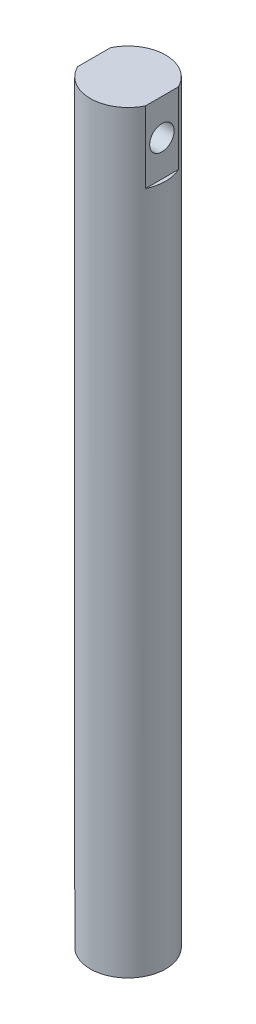
ISO-10303-21;
HEADER;
FILE_DESCRIPTION(('STEP AP214'),'2;1');
FILE_NAME('part.step','',(''),(''),'','','');
FILE_SCHEMA(('AUTOMOTIVE_DESIGN { 1 0 10303 214 1 1 1 1 }'));
ENDSEC;
DATA;
#1=APPLICATION_CONTEXT('core data for automotive mechanical design processes');
#2=APPLICATION_PROTOCOL_DEFINITION('international standard','automotive_design',2000,#1);
#3=PRODUCT_CONTEXT('',#1,'mechanical');
#4=PRODUCT('Part','Part','',(#3));
#5=PRODUCT_RELATED_PRODUCT_CATEGORY('part','',(#4));
#6=PRODUCT_DEFINITION_FORMATION('','',#4);
#7=PRODUCT_DEFINITION_CONTEXT('part definition',#1,'design');
#8=PRODUCT_DEFINITION('design','',#6,#7);
#9=PRODUCT_DEFINITION_SHAPE('','',#8);
#10=(LENGTH_UNIT() NAMED_UNIT(*) SI_UNIT(.MILLI.,.METRE.));
#11=(NAMED_UNIT(*) PLANE_ANGLE_UNIT() SI_UNIT($,.RADIAN.));
#12=(NAMED_UNIT(*) SI_UNIT($,.STERADIAN.) SOLID_ANGLE_UNIT());
#13=UNCERTAINTY_MEASURE_WITH_UNIT(LENGTH_MEASURE(1.E-05),#10,'distance_accuracy_value','');
#14=(GEOMETRIC_REPRESENTATION_CONTEXT(3) GLOBAL_UNCERTAINTY_ASSIGNED_CONTEXT((#13)) GLOBAL_UNIT_ASSIGNED_CONTEXT((#10,
#11,#12)) REPRESENTATION_CONTEXT('',''));
#15=CARTESIAN_POINT('',(0.,0.,0.));
#16=DIRECTION('',(0.,0.,1.));
#17=DIRECTION('',(1.,0.,0.));
#18=AXIS2_PLACEMENT_3D('',#15,#16,#17);
#19=CARTESIAN_POINT('',(0.,200.,0.));
#20=DIRECTION('',(0.,-1.,0.));
#21=DIRECTION('',(0.,0.,-1.));
#22=AXIS2_PLACEMENT_3D('',#19,#20,#21);
#23=CYLINDRICAL_SURFACE('',#22,10.);
#24=CARTESIAN_POINT('',(0.,200.,0.));
#25=DIRECTION('',(0.,1.,0.));
#26=DIRECTION('',(0.,0.,1.));
#27=AXIS2_PLACEMENT_3D('',#24,#25,#26);
#28=CIRCLE('',#27,10.);
#29=CARTESIAN_POINT('',(9.,200.,-4.35889894354067));
#30=VERTEX_POINT('',#29);
#31=CARTESIAN_POINT('',(-9.,200.,-4.35889894354067));
#32=VERTEX_POINT('',#31);
#33=EDGE_CURVE('E45',#30,#32,#28,.T.);
#34=ORIENTED_EDGE('',*,*,#33,.F.);
#35=DIRECTION('',(0.,1.,0.));
#36=VECTOR('',#35,1.);
#37=CARTESIAN_POINT('',(9.,181.,-4.35889894354067));
#38=LINE('',#37,#36);
#39=CARTESIAN_POINT('',(9.,181.,-4.35889894354067));
#40=VERTEX_POINT('',#39);
#41=EDGE_CURVE('E53',#40,#30,#38,.T.);
#42=ORIENTED_EDGE('',*,*,#41,.F.);
#43=CARTESIAN_POINT('',(0.,181.,0.));
#44=DIRECTION('',(0.,1.,0.));
#45=DIRECTION('',(0.,0.,1.));
#46=AXIS2_PLACEMENT_3D('',#43,#44,#45);
#47=CIRCLE('',#46,10.);
#48=CARTESIAN_POINT('',(9.,181.,4.35889894354067));
#49=VERTEX_POINT('',#48);
#50=EDGE_CURVE('E81',#49,#40,#47,.T.);
#51=ORIENTED_EDGE('',*,*,#50,.F.);
#52=DIRECTION('',(0.,1.,0.));
#53=VECTOR('',#52,1.);
#54=CARTESIAN_POINT('',(9.,181.,4.35889894354067));
#55=LINE('',#54,#53);
#56=CARTESIAN_POINT('',(9.,200.,4.35889894354067));
#57=VERTEX_POINT('',#56);
#58=EDGE_CURVE('E89',#49,#57,#55,.T.);
#59=ORIENTED_EDGE('',*,*,#58,.T.);
#60=CARTESIAN_POINT('',(-9.,200.,4.35889894354067));
#61=VERTEX_POINT('',#60);
#62=EDGE_CURVE('E11',#61,#57,#28,.T.);
#63=ORIENTED_EDGE('',*,*,#62,.F.);
#64=DIRECTION('',(0.,1.,0.));
#65=VECTOR('',#64,1.);
#66=CARTESIAN_POINT('',(-9.,181.,4.35889894354067));
#67=LINE('',#66,#65);
#68=CARTESIAN_POINT('',(-9.,181.,4.35889894354067));
#69=VERTEX_POINT('',#68);
#70=EDGE_CURVE('E61',#69,#61,#67,.T.);
#71=ORIENTED_EDGE('',*,*,#70,.F.);
#72=CARTESIAN_POINT('',(0.,181.,0.));
#73=DIRECTION('',(0.,1.,0.));
#74=DIRECTION('',(0.,0.,1.));
#75=AXIS2_PLACEMENT_3D('',#72,#73,#74);
#76=CIRCLE('',#75,10.);
#77=CARTESIAN_POINT('',(-9.,181.,-4.35889894354067));
#78=VERTEX_POINT('',#77);
#79=EDGE_CURVE('E101',#78,#69,#76,.T.);
#80=ORIENTED_EDGE('',*,*,#79,.F.);
#81=DIRECTION('',(0.,1.,0.));
#82=VECTOR('',#81,1.);
#83=CARTESIAN_POINT('',(-9.,181.,-4.35889894354067));
#84=LINE('',#83,#82);
#85=EDGE_CURVE('E104',#78,#32,#84,.T.);
#86=ORIENTED_EDGE('',*,*,#85,.T.);
#87=EDGE_LOOP('',(#34,#42,#51,#59,#63,#71,#80,#86));
#88=FACE_BOUND('',#87,.T.);
#89=CARTESIAN_POINT('',(0.,0.,0.));
#90=DIRECTION('',(0.,1.,0.));
#91=DIRECTION('',(0.,0.,1.));
#92=AXIS2_PLACEMENT_3D('',#89,#90,#91);
#93=CIRCLE('',#92,10.);
#94=CARTESIAN_POINT('',(0.,0.,10.));
#95=VERTEX_POINT('',#94);
#96=EDGE_CURVE('E107',#95,#95,#93,.T.);
#97=ORIENTED_EDGE('',*,*,#96,.T.);
#98=EDGE_LOOP('',(#97));
#99=FACE_BOUND('',#98,.T.);
#100=ADVANCED_FACE('F37',(#88,#99),#23,.T.);
#101=CARTESIAN_POINT('',(0.,200.,0.));
#102=DIRECTION('',(0.,1.,0.));
#103=DIRECTION('',(0.,0.,1.));
#104=AXIS2_PLACEMENT_3D('',#101,#102,#103);
#105=PLANE('',#104);
#106=DIRECTION('',(0.,0.,1.));
#107=VECTOR('',#106,1.);
#108=CARTESIAN_POINT('',(9.,200.,0.));
#109=LINE('',#108,#107);
#110=EDGE_CURVE('E86',#30,#57,#109,.T.);
#111=ORIENTED_EDGE('',*,*,#110,.F.);
#112=ORIENTED_EDGE('',*,*,#33,.T.);
#113=DIRECTION('',(0.,0.,1.));
#114=VECTOR('',#113,1.);
#115=CARTESIAN_POINT('',(-9.,200.,0.));
#116=LINE('',#115,#114);
#117=EDGE_CURVE('E95',#32,#61,#116,.T.);
#118=ORIENTED_EDGE('',*,*,#117,.T.);
#119=ORIENTED_EDGE('',*,*,#62,.T.);
#120=EDGE_LOOP('',(#111,#112,#118,#119));
#121=FACE_BOUND('',#120,.T.);
#122=ADVANCED_FACE('F111',(#121),#105,.T.);
#123=CARTESIAN_POINT('',(0.,0.,0.));
#124=DIRECTION('',(0.,1.,0.));
#125=DIRECTION('',(0.,0.,1.));
#126=AXIS2_PLACEMENT_3D('',#123,#124,#125);
#127=PLANE('',#126);
#128=ORIENTED_EDGE('',*,*,#96,.F.);
#129=EDGE_LOOP('',(#128));
#130=FACE_BOUND('',#129,.T.);
#131=ADVANCED_FACE('F126',(#130),#127,.F.);
#132=CARTESIAN_POINT('',(-9.,181.,0.));
#133=DIRECTION('',(-1.,0.,0.));
#134=DIRECTION('',(0.,0.,1.));
#135=AXIS2_PLACEMENT_3D('',#132,#133,#134);
#136=PLANE('',#135);
#137=CARTESIAN_POINT('',(-9.,190.5,0.));
#138=DIRECTION('',(-1.,0.,0.));
#139=DIRECTION('',(0.,0.,1.));
#140=AXIS2_PLACEMENT_3D('',#137,#138,#139);
#141=CIRCLE('',#140,3.25);
#142=CARTESIAN_POINT('',(-9.,190.5,3.25));
#143=VERTEX_POINT('',#142);
#144=EDGE_CURVE('E177',#143,#143,#141,.T.);
#145=ORIENTED_EDGE('',*,*,#144,.F.);
#146=EDGE_LOOP('',(#145));
#147=FACE_BOUND('',#146,.T.);
#148=ORIENTED_EDGE('',*,*,#117,.F.);
#149=ORIENTED_EDGE('',*,*,#85,.F.);
#150=DIRECTION('',(0.,0.,1.));
#151=VECTOR('',#150,1.);
#152=CARTESIAN_POINT('',(-9.,181.,0.));
#153=LINE('',#152,#151);
#154=EDGE_CURVE('E99',#78,#69,#153,.T.);
#155=ORIENTED_EDGE('',*,*,#154,.T.);
#156=ORIENTED_EDGE('',*,*,#70,.T.);
#157=EDGE_LOOP('',(#148,#149,#155,#156));
#158=FACE_BOUND('',#157,.T.);
#159=ADVANCED_FACE('F113',(#147,#158),#136,.T.);
#160=CARTESIAN_POINT('',(0.,181.,0.));
#161=DIRECTION('',(0.,1.,0.));
#162=DIRECTION('',(0.,0.,1.));
#163=AXIS2_PLACEMENT_3D('',#160,#161,#162);
#164=PLANE('',#163);
#165=ORIENTED_EDGE('',*,*,#154,.F.);
#166=ORIENTED_EDGE('',*,*,#79,.T.);
#167=EDGE_LOOP('',(#165,#166));
#168=FACE_BOUND('',#167,.T.);
#169=ADVANCED_FACE('F117',(#168),#164,.T.);
#170=CARTESIAN_POINT('',(9.,181.,0.));
#171=DIRECTION('',(-1.,0.,0.));
#172=DIRECTION('',(0.,0.,1.));
#173=AXIS2_PLACEMENT_3D('',#170,#171,#172);
#174=PLANE('',#173);
#175=CARTESIAN_POINT('',(9.,190.5,0.));
#176=DIRECTION('',(-1.,0.,0.));
#177=DIRECTION('',(0.,0.,1.));
#178=AXIS2_PLACEMENT_3D('',#175,#176,#177);
#179=CIRCLE('',#178,3.25);
#180=CARTESIAN_POINT('',(9.,190.5,3.25));
#181=VERTEX_POINT('',#180);
#182=EDGE_CURVE('E40',#181,#181,#179,.T.);
#183=ORIENTED_EDGE('',*,*,#182,.T.);
#184=EDGE_LOOP('',(#183));
#185=FACE_BOUND('',#184,.T.);
#186=ORIENTED_EDGE('',*,*,#110,.T.);
#187=ORIENTED_EDGE('',*,*,#58,.F.);
#188=DIRECTION('',(0.,0.,1.));
#189=VECTOR('',#188,1.);
#190=CARTESIAN_POINT('',(9.,181.,0.));
#191=LINE('',#190,#189);
#192=EDGE_CURVE('E83',#40,#49,#191,.T.);
#193=ORIENTED_EDGE('',*,*,#192,.F.);
#194=ORIENTED_EDGE('',*,*,#41,.T.);
#195=EDGE_LOOP('',(#186,#187,#193,#194));
#196=FACE_BOUND('',#195,.T.);
#197=ADVANCED_FACE('F88',(#185,#196),#174,.F.);
#198=CARTESIAN_POINT('',(0.,181.,0.));
#199=DIRECTION('',(0.,1.,0.));
#200=DIRECTION('',(0.,0.,1.));
#201=AXIS2_PLACEMENT_3D('',#198,#199,#200);
#202=PLANE('',#201);
#203=ORIENTED_EDGE('',*,*,#50,.T.);
#204=ORIENTED_EDGE('',*,*,#192,.T.);
#205=EDGE_LOOP('',(#203,#204));
#206=FACE_BOUND('',#205,.T.);
#207=ADVANCED_FACE('F82',(#206),#202,.T.);
#208=CARTESIAN_POINT('',(10.,190.5,0.));
#209=DIRECTION('',(-1.,0.,0.));
#210=DIRECTION('',(0.,0.,1.));
#211=AXIS2_PLACEMENT_3D('',#208,#209,#210);
#212=CYLINDRICAL_SURFACE('',#211,3.25);
#213=ORIENTED_EDGE('',*,*,#144,.T.);
#214=EDGE_LOOP('',(#213));
#215=FACE_BOUND('',#214,.T.);
#216=ORIENTED_EDGE('',*,*,#182,.F.);
#217=EDGE_LOOP('',(#216));
#218=FACE_BOUND('',#217,.T.);
#219=ADVANCED_FACE('F161',(#215,#218),#212,.F.);
#220=CLOSED_SHELL('',(#100,#122,#131,#159,#169,#197,#207,#219));
#221=MANIFOLD_SOLID_BREP('B2',#220);
#222=ADVANCED_BREP_SHAPE_REPRESENTATION('',(#18,#221),#14);
#223=SHAPE_DEFINITION_REPRESENTATION(#9,#222);
ENDSEC;
END-ISO-10303-21;
